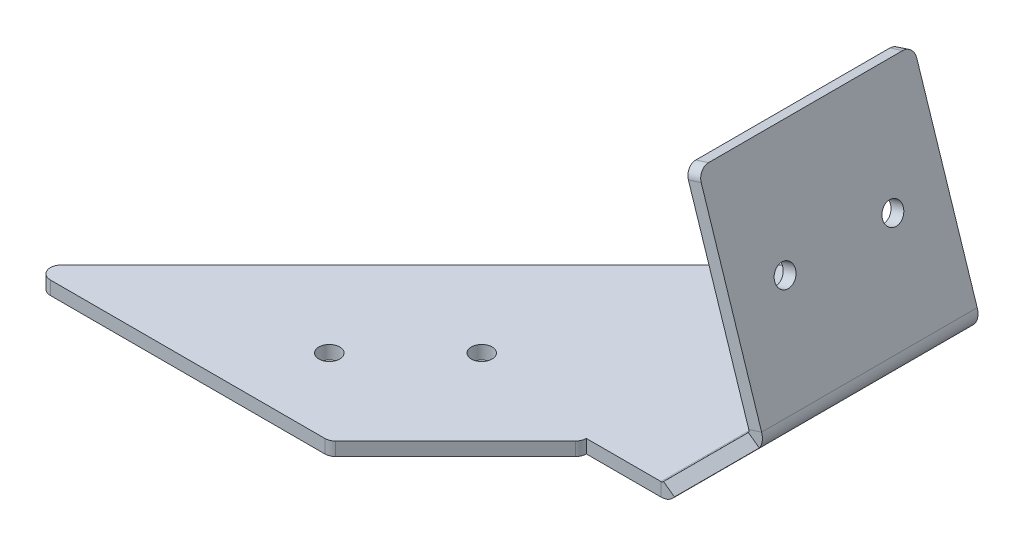
ISO-10303-21;
HEADER;
FILE_DESCRIPTION(('STEP AP214'),'2;1');
FILE_NAME('part.step','',(''),(''),'','','');
FILE_SCHEMA(('AUTOMOTIVE_DESIGN { 1 0 10303 214 1 1 1 1 }'));
ENDSEC;
DATA;
#1=APPLICATION_CONTEXT('core data for automotive mechanical design processes');
#2=APPLICATION_PROTOCOL_DEFINITION('international standard','automotive_design',2000,#1);
#3=PRODUCT_CONTEXT('',#1,'mechanical');
#4=PRODUCT('Part','Part','',(#3));
#5=PRODUCT_RELATED_PRODUCT_CATEGORY('part','',(#4));
#6=PRODUCT_DEFINITION_FORMATION('','',#4);
#7=PRODUCT_DEFINITION_CONTEXT('part definition',#1,'design');
#8=PRODUCT_DEFINITION('design','',#6,#7);
#9=PRODUCT_DEFINITION_SHAPE('','',#8);
#10=(LENGTH_UNIT() NAMED_UNIT(*) SI_UNIT(.MILLI.,.METRE.));
#11=(NAMED_UNIT(*) PLANE_ANGLE_UNIT() SI_UNIT($,.RADIAN.));
#12=(NAMED_UNIT(*) SI_UNIT($,.STERADIAN.) SOLID_ANGLE_UNIT());
#13=UNCERTAINTY_MEASURE_WITH_UNIT(LENGTH_MEASURE(1.E-05),#10,'distance_accuracy_value','');
#14=(GEOMETRIC_REPRESENTATION_CONTEXT(3) GLOBAL_UNCERTAINTY_ASSIGNED_CONTEXT((#13)) GLOBAL_UNIT_ASSIGNED_CONTEXT((#10,
#11,#12)) REPRESENTATION_CONTEXT('',''));
#15=CARTESIAN_POINT('',(0.,0.,0.));
#16=DIRECTION('',(0.,0.,1.));
#17=DIRECTION('',(1.,0.,0.));
#18=AXIS2_PLACEMENT_3D('',#15,#16,#17);
#19=CARTESIAN_POINT('',(-13.300085244457,-0.137855345025698,25.4));
#20=DIRECTION('',(0.,0.,1.));
#21=DIRECTION('',(-0.309016994374951,0.951056516295152,0.));
#22=AXIS2_PLACEMENT_3D('',#19,#20,#21);
#23=PLANE('',#22);
#24=DIRECTION('',(-0.309016994374951,0.951056516295152,0.));
#25=VECTOR('',#24,1.);
#26=CARTESIAN_POINT('',(-16.3196896836941,-1.11898430216617,25.4));
#27=LINE('',#26,#25);
#28=CARTESIAN_POINT('',(-16.9965644159594,0.964221918056588,25.4));
#29=VERTEX_POINT('',#28);
#30=CARTESIAN_POINT('',(-31.2328498322293,44.7790031742379,25.4));
#31=VERTEX_POINT('',#30);
#32=EDGE_CURVE('E197',#29,#31,#27,.T.);
#33=ORIENTED_EDGE('',*,*,#32,.F.);
#34=DIRECTION('',(0.951056516295152,0.309016994374951,0.));
#35=VECTOR('',#34,1.);
#36=CARTESIAN_POINT('',(-13.9769599767223,1.94535087519706,25.4));
#37=LINE('',#36,#35);
#38=CARTESIAN_POINT('',(-13.9769599767223,1.94535087519706,25.4));
#39=VERTEX_POINT('',#38);
#40=EDGE_CURVE('E180',#29,#39,#37,.T.);
#41=ORIENTED_EDGE('',*,*,#40,.T.);
#42=DIRECTION('',(-0.309016994374951,0.951056516295152,0.));
#43=VECTOR('',#42,1.);
#44=CARTESIAN_POINT('',(-13.300085244457,-0.137855345025698,25.4));
#45=LINE('',#44,#43);
#46=CARTESIAN_POINT('',(-28.2132453929921,45.7601321313783,25.4));
#47=VERTEX_POINT('',#46);
#48=EDGE_CURVE('E47',#39,#47,#45,.T.);
#49=ORIENTED_EDGE('',*,*,#48,.T.);
#50=DIRECTION('',(-0.951056516295152,-0.309016994374951,0.));
#51=VECTOR('',#50,1.);
#52=CARTESIAN_POINT('',(-28.2132453929921,45.7601321313783,25.4));
#53=LINE('',#52,#51);
#54=EDGE_CURVE('E226',#47,#31,#53,.T.);
#55=ORIENTED_EDGE('',*,*,#54,.T.);
#56=EDGE_LOOP('',(#33,#41,#49,#55));
#57=FACE_BOUND('',#56,.T.);
#58=ADVANCED_FACE('F43',(#57),#23,.T.);
#59=CARTESIAN_POINT('',(-7.18568958355758,-18.9560302103514,-25.4));
#60=DIRECTION('',(0.,0.,-1.));
#61=DIRECTION('',(0.309016994374951,-0.951056516295152,0.));
#62=AXIS2_PLACEMENT_3D('',#59,#60,#61);
#63=PLANE('',#62);
#64=DIRECTION('',(0.309016994374951,-0.951056516295152,0.));
#65=VECTOR('',#64,1.);
#66=CARTESIAN_POINT('',(-7.18568958355758,-18.9560302103514,-25.4));
#67=LINE('',#66,#65);
#68=CARTESIAN_POINT('',(-28.2132453929921,45.7601321313783,-25.4));
#69=VERTEX_POINT('',#68);
#70=CARTESIAN_POINT('',(-13.9769599767223,1.94535087519706,-25.4));
#71=VERTEX_POINT('',#70);
#72=EDGE_CURVE('E195',#69,#71,#67,.T.);
#73=ORIENTED_EDGE('',*,*,#72,.T.);
#74=DIRECTION('',(-0.951056516295152,-0.309016994374951,0.));
#75=VECTOR('',#74,1.);
#76=CARTESIAN_POINT('',(-13.9769599767223,1.94535087519706,-25.4));
#77=LINE('',#76,#75);
#78=CARTESIAN_POINT('',(-16.9965644159594,0.964221918056588,-25.4));
#79=VERTEX_POINT('',#78);
#80=EDGE_CURVE('E12',#71,#79,#77,.T.);
#81=ORIENTED_EDGE('',*,*,#80,.T.);
#82=DIRECTION('',(0.309016994374951,-0.951056516295152,0.));
#83=VECTOR('',#82,1.);
#84=CARTESIAN_POINT('',(-10.2052940227947,-19.9371591674918,-25.4));
#85=LINE('',#84,#83);
#86=CARTESIAN_POINT('',(-31.2328498322293,44.7790031742379,-25.4));
#87=VERTEX_POINT('',#86);
#88=EDGE_CURVE('E205',#87,#79,#85,.T.);
#89=ORIENTED_EDGE('',*,*,#88,.F.);
#90=DIRECTION('',(-0.951056516295152,-0.309016994374951,0.));
#91=VECTOR('',#90,1.);
#92=CARTESIAN_POINT('',(-28.2132453929921,45.7601321313783,-25.4));
#93=LINE('',#92,#91);
#94=EDGE_CURVE('E69',#69,#87,#93,.T.);
#95=ORIENTED_EDGE('',*,*,#94,.F.);
#96=EDGE_LOOP('',(#73,#81,#89,#95));
#97=FACE_BOUND('',#96,.T.);
#98=ADVANCED_FACE('F45',(#97),#63,.T.);
#99=CARTESIAN_POINT('',(-28.2132453929921,45.7601321313783,-22.86));
#100=DIRECTION('',(0.951056516295152,0.309016994374951,0.));
#101=DIRECTION('',(0.,0.,-1.));
#102=AXIS2_PLACEMENT_3D('',#99,#100,#101);
#103=PLANE('',#102);
#104=CARTESIAN_POINT('',(-21.1491169015808,24.0189801688712,12.7));
#105=DIRECTION('',(-0.951056516295152,-0.309016994374951,0.));
#106=DIRECTION('',(0.,0.,1.));
#107=AXIS2_PLACEMENT_3D('',#104,#105,#106);
#108=CIRCLE('',#107,2.4638);
#109=CARTESIAN_POINT('',(-21.1491169015808,24.0189801688712,15.1638));
#110=VERTEX_POINT('',#109);
#111=EDGE_CURVE('E207',#110,#110,#108,.T.);
#112=ORIENTED_EDGE('',*,*,#111,.T.);
#113=EDGE_LOOP('',(#112));
#114=FACE_BOUND('',#113,.T.);
#115=CARTESIAN_POINT('',(-21.1491169015808,24.0189801688712,-12.7));
#116=DIRECTION('',(-0.951056516295152,-0.309016994374951,0.));
#117=DIRECTION('',(0.,0.,1.));
#118=AXIS2_PLACEMENT_3D('',#115,#116,#117);
#119=CIRCLE('',#118,2.4638);
#120=CARTESIAN_POINT('',(-21.1491169015808,24.0189801688712,-10.2362));
#121=VERTEX_POINT('',#120);
#122=EDGE_CURVE('E236',#121,#121,#119,.T.);
#123=ORIENTED_EDGE('',*,*,#122,.T.);
#124=EDGE_LOOP('',(#123));
#125=FACE_BOUND('',#124,.T.);
#126=ORIENTED_EDGE('',*,*,#48,.F.);
#127=DIRECTION('',(0.,0.,-1.));
#128=VECTOR('',#127,1.);
#129=CARTESIAN_POINT('',(-13.9769599767223,1.94535087519706,-22.86));
#130=LINE('',#129,#128);
#131=EDGE_CURVE('E173',#39,#71,#130,.T.);
#132=ORIENTED_EDGE('',*,*,#131,.T.);
#133=ORIENTED_EDGE('',*,*,#72,.F.);
#134=CARTESIAN_POINT('',(-28.2132453929921,45.7601321313783,-22.86));
#135=DIRECTION('',(-0.951056516295152,-0.309016994374951,0.));
#136=DIRECTION('',(0.,0.,-1.));
#137=AXIS2_PLACEMENT_3D('',#134,#135,#136);
#138=CIRCLE('',#137,2.54000000000001);
#139=CARTESIAN_POINT('',(-28.9981485587045,48.175815682768,-22.86));
#140=VERTEX_POINT('',#139);
#141=EDGE_CURVE('E217',#140,#69,#138,.T.);
#142=ORIENTED_EDGE('',*,*,#141,.F.);
#143=DIRECTION('',(0.,0.,-1.));
#144=VECTOR('',#143,1.);
#145=CARTESIAN_POINT('',(-28.9981485587045,48.175815682768,22.86));
#146=LINE('',#145,#144);
#147=CARTESIAN_POINT('',(-28.9981485587045,48.175815682768,22.86));
#148=VERTEX_POINT('',#147);
#149=EDGE_CURVE('E227',#148,#140,#146,.T.);
#150=ORIENTED_EDGE('',*,*,#149,.F.);
#151=CARTESIAN_POINT('',(-28.2132453929921,45.7601321313783,22.86));
#152=DIRECTION('',(-0.951056516295152,-0.309016994374951,0.));
#153=DIRECTION('',(0.,0.,1.));
#154=AXIS2_PLACEMENT_3D('',#151,#152,#153);
#155=CIRCLE('',#154,2.54);
#156=EDGE_CURVE('E194',#47,#148,#155,.T.);
#157=ORIENTED_EDGE('',*,*,#156,.F.);
#158=EDGE_LOOP('',(#126,#132,#133,#142,#150,#157));
#159=FACE_BOUND('',#158,.T.);
#160=ADVANCED_FACE('F191',(#114,#125,#159),#103,.T.);
#161=CARTESIAN_POINT('',(-28.2132453929921,45.7601321313783,-22.86));
#162=DIRECTION('',(-0.951056516295152,-0.309016994374951,0.));
#163=DIRECTION('',(0.,0.,1.));
#164=AXIS2_PLACEMENT_3D('',#161,#162,#163);
#165=CYLINDRICAL_SURFACE('',#164,2.54000000000001);
#166=CARTESIAN_POINT('',(-31.2328498322293,44.7790031742379,-22.86));
#167=DIRECTION('',(-0.951056516295152,-0.309016994374951,0.));
#168=DIRECTION('',(0.,0.,-1.));
#169=AXIS2_PLACEMENT_3D('',#166,#167,#168);
#170=CIRCLE('',#169,2.54000000000001);
#171=CARTESIAN_POINT('',(-32.0177529979416,47.1946867256276,-22.86));
#172=VERTEX_POINT('',#171);
#173=EDGE_CURVE('E204',#172,#87,#170,.T.);
#174=ORIENTED_EDGE('',*,*,#173,.F.);
#175=DIRECTION('',(-0.951056516295152,-0.309016994374951,0.));
#176=VECTOR('',#175,1.);
#177=CARTESIAN_POINT('',(-28.9981485587045,48.175815682768,-22.86));
#178=LINE('',#177,#176);
#179=EDGE_CURVE('E223',#140,#172,#178,.T.);
#180=ORIENTED_EDGE('',*,*,#179,.F.);
#181=ORIENTED_EDGE('',*,*,#141,.T.);
#182=ORIENTED_EDGE('',*,*,#94,.T.);
#183=EDGE_LOOP('',(#174,#180,#181,#182));
#184=FACE_BOUND('',#183,.T.);
#185=ADVANCED_FACE('F442',(#184),#165,.T.);
#186=CARTESIAN_POINT('',(-28.9981485587045,48.175815682768,22.86));
#187=DIRECTION('',(-0.309016994374951,0.951056516295152,0.));
#188=DIRECTION('',(0.,0.,-1.));
#189=AXIS2_PLACEMENT_3D('',#186,#187,#188);
#190=PLANE('',#189);
#191=DIRECTION('',(0.,0.,-1.));
#192=VECTOR('',#191,1.);
#193=CARTESIAN_POINT('',(-32.0177529979416,47.1946867256276,22.86));
#194=LINE('',#193,#192);
#195=CARTESIAN_POINT('',(-32.0177529979416,47.1946867256276,22.86));
#196=VERTEX_POINT('',#195);
#197=EDGE_CURVE('E211',#196,#172,#194,.T.);
#198=ORIENTED_EDGE('',*,*,#197,.F.);
#199=DIRECTION('',(-0.951056516295152,-0.309016994374951,0.));
#200=VECTOR('',#199,1.);
#201=CARTESIAN_POINT('',(-28.9981485587045,48.175815682768,22.86));
#202=LINE('',#201,#200);
#203=EDGE_CURVE('E225',#148,#196,#202,.T.);
#204=ORIENTED_EDGE('',*,*,#203,.F.);
#205=ORIENTED_EDGE('',*,*,#149,.T.);
#206=ORIENTED_EDGE('',*,*,#179,.T.);
#207=EDGE_LOOP('',(#198,#204,#205,#206));
#208=FACE_BOUND('',#207,.T.);
#209=ADVANCED_FACE('F420',(#208),#190,.T.);
#210=CARTESIAN_POINT('',(-28.2132453929921,45.7601321313783,22.86));
#211=DIRECTION('',(-0.951056516295152,-0.309016994374951,0.));
#212=DIRECTION('',(0.,0.,1.));
#213=AXIS2_PLACEMENT_3D('',#210,#211,#212);
#214=CYLINDRICAL_SURFACE('',#213,2.54);
#215=CARTESIAN_POINT('',(-31.2328498322293,44.7790031742379,22.86));
#216=DIRECTION('',(-0.951056516295152,-0.309016994374951,0.));
#217=DIRECTION('',(0.,0.,1.));
#218=AXIS2_PLACEMENT_3D('',#215,#216,#217);
#219=CIRCLE('',#218,2.54);
#220=EDGE_CURVE('E208',#31,#196,#219,.T.);
#221=ORIENTED_EDGE('',*,*,#220,.F.);
#222=ORIENTED_EDGE('',*,*,#54,.F.);
#223=ORIENTED_EDGE('',*,*,#156,.T.);
#224=ORIENTED_EDGE('',*,*,#203,.T.);
#225=EDGE_LOOP('',(#221,#222,#223,#224));
#226=FACE_BOUND('',#225,.T.);
#227=ADVANCED_FACE('F412',(#226),#214,.T.);
#228=CARTESIAN_POINT('',(-31.2328498322293,44.7790031742379,-22.86));
#229=DIRECTION('',(0.951056516295152,0.309016994374951,0.));
#230=DIRECTION('',(0.,0.,-1.));
#231=AXIS2_PLACEMENT_3D('',#228,#229,#230);
#232=PLANE('',#231);
#233=DIRECTION('',(0.,0.,-1.));
#234=VECTOR('',#233,1.);
#235=CARTESIAN_POINT('',(-16.9965644159594,0.964221918056587,-22.86));
#236=LINE('',#235,#234);
#237=EDGE_CURVE('E52',#29,#79,#236,.T.);
#238=ORIENTED_EDGE('',*,*,#237,.F.);
#239=ORIENTED_EDGE('',*,*,#32,.T.);
#240=ORIENTED_EDGE('',*,*,#220,.T.);
#241=ORIENTED_EDGE('',*,*,#197,.T.);
#242=ORIENTED_EDGE('',*,*,#173,.T.);
#243=ORIENTED_EDGE('',*,*,#88,.T.);
#244=EDGE_LOOP('',(#238,#239,#240,#241,#242,#243));
#245=FACE_BOUND('',#244,.T.);
#246=CARTESIAN_POINT('',(-24.1687213408179,23.0378512117307,-12.7));
#247=DIRECTION('',(-0.951056516295152,-0.309016994374951,0.));
#248=DIRECTION('',(0.,0.,1.));
#249=AXIS2_PLACEMENT_3D('',#246,#247,#248);
#250=CIRCLE('',#249,2.4638);
#251=CARTESIAN_POINT('',(-24.1687213408179,23.0378512117307,-10.2362));
#252=VERTEX_POINT('',#251);
#253=EDGE_CURVE('E239',#252,#252,#250,.T.);
#254=ORIENTED_EDGE('',*,*,#253,.F.);
#255=EDGE_LOOP('',(#254));
#256=FACE_BOUND('',#255,.T.);
#257=CARTESIAN_POINT('',(-24.1687213408179,23.0378512117307,12.7));
#258=DIRECTION('',(-0.951056516295152,-0.309016994374951,0.));
#259=DIRECTION('',(0.,0.,1.));
#260=AXIS2_PLACEMENT_3D('',#257,#258,#259);
#261=CIRCLE('',#260,2.4638);
#262=CARTESIAN_POINT('',(-24.1687213408179,23.0378512117307,15.1638));
#263=VERTEX_POINT('',#262);
#264=EDGE_CURVE('E233',#263,#263,#261,.T.);
#265=ORIENTED_EDGE('',*,*,#264,.F.);
#266=EDGE_LOOP('',(#265));
#267=FACE_BOUND('',#266,.T.);
#268=ADVANCED_FACE('F409',(#245,#256,#267),#232,.F.);
#269=CARTESIAN_POINT('',(-21.1491169015808,24.0189801688712,12.7));
#270=DIRECTION('',(-0.951056516295152,-0.309016994374951,0.));
#271=DIRECTION('',(0.,0.,1.));
#272=AXIS2_PLACEMENT_3D('',#269,#270,#271);
#273=CYLINDRICAL_SURFACE('',#272,2.4638);
#274=ORIENTED_EDGE('',*,*,#111,.F.);
#275=EDGE_LOOP('',(#274));
#276=FACE_BOUND('',#275,.T.);
#277=ORIENTED_EDGE('',*,*,#264,.T.);
#278=EDGE_LOOP('',(#277));
#279=FACE_BOUND('',#278,.T.);
#280=ADVANCED_FACE('F411',(#276,#279),#273,.F.);
#281=CARTESIAN_POINT('',(-21.1491169015808,24.0189801688712,-12.7));
#282=DIRECTION('',(-0.951056516295152,-0.309016994374951,0.));
#283=DIRECTION('',(0.,0.,1.));
#284=AXIS2_PLACEMENT_3D('',#281,#282,#283);
#285=CYLINDRICAL_SURFACE('',#284,2.4638);
#286=ORIENTED_EDGE('',*,*,#122,.F.);
#287=EDGE_LOOP('',(#286));
#288=FACE_BOUND('',#287,.T.);
#289=ORIENTED_EDGE('',*,*,#253,.T.);
#290=EDGE_LOOP('',(#289));
#291=FACE_BOUND('',#290,.T.);
#292=ADVANCED_FACE('F417',(#288,#291),#285,.F.);
#293=CARTESIAN_POINT('',(-83.0117632735845,-3.175,58.2394877578619));
#294=DIRECTION('',(0.,1.,0.));
#295=DIRECTION('',(0.,0.,1.));
#296=AXIS2_PLACEMENT_3D('',#293,#294,#295);
#297=CYLINDRICAL_SURFACE('',#296,2.46380000000007);
#298=CARTESIAN_POINT('',(-83.0117632735845,-3.175,58.2394877578619));
#299=DIRECTION('',(0.,1.,0.));
#300=DIRECTION('',(0.,0.,1.));
#301=AXIS2_PLACEMENT_3D('',#298,#299,#300);
#302=CIRCLE('',#301,2.46380000000007);
#303=CARTESIAN_POINT('',(-83.0117632735845,-3.175,60.703287757862));
#304=VERTEX_POINT('',#303);
#305=EDGE_CURVE('E292',#304,#304,#302,.T.);
#306=ORIENTED_EDGE('',*,*,#305,.F.);
#307=EDGE_LOOP('',(#306));
#308=FACE_BOUND('',#307,.T.);
#309=CARTESIAN_POINT('',(-83.0117632735845,0.,58.2394877578619));
#310=DIRECTION('',(0.,1.,0.));
#311=DIRECTION('',(0.,0.,1.));
#312=AXIS2_PLACEMENT_3D('',#309,#310,#311);
#313=CIRCLE('',#312,2.46380000000007);
#314=CARTESIAN_POINT('',(-83.0117632735845,0.,60.703287757862));
#315=VERTEX_POINT('',#314);
#316=EDGE_CURVE('E253',#315,#315,#313,.T.);
#317=ORIENTED_EDGE('',*,*,#316,.T.);
#318=EDGE_LOOP('',(#317));
#319=FACE_BOUND('',#318,.T.);
#320=ADVANCED_FACE('F429',(#308,#319),#297,.F.);
#321=CARTESIAN_POINT('',(-65.0512510314461,-3.175,40.2789755157237));
#322=DIRECTION('',(0.,1.,0.));
#323=DIRECTION('',(0.,0.,1.));
#324=AXIS2_PLACEMENT_3D('',#321,#322,#323);
#325=CYLINDRICAL_SURFACE('',#324,2.46380000000007);
#326=CARTESIAN_POINT('',(-65.0512510314461,-3.175,40.2789755157237));
#327=DIRECTION('',(0.,1.,0.));
#328=DIRECTION('',(0.,0.,1.));
#329=AXIS2_PLACEMENT_3D('',#326,#327,#328);
#330=CIRCLE('',#329,2.46380000000007);
#331=CARTESIAN_POINT('',(-65.0512510314461,-3.175,42.7427755157238));
#332=VERTEX_POINT('',#331);
#333=EDGE_CURVE('E289',#332,#332,#330,.T.);
#334=ORIENTED_EDGE('',*,*,#333,.F.);
#335=EDGE_LOOP('',(#334));
#336=FACE_BOUND('',#335,.T.);
#337=CARTESIAN_POINT('',(-65.0512510314461,0.,40.2789755157237));
#338=DIRECTION('',(0.,1.,0.));
#339=DIRECTION('',(0.,0.,1.));
#340=AXIS2_PLACEMENT_3D('',#337,#338,#339);
#341=CIRCLE('',#340,2.46380000000007);
#342=CARTESIAN_POINT('',(-65.0512510314461,0.,42.7427755157238));
#343=VERTEX_POINT('',#342);
#344=EDGE_CURVE('E256',#343,#343,#341,.T.);
#345=ORIENTED_EDGE('',*,*,#344,.T.);
#346=EDGE_LOOP('',(#345));
#347=FACE_BOUND('',#346,.T.);
#348=ADVANCED_FACE('F435',(#336,#347),#325,.F.);
#349=CARTESIAN_POINT('',(-35.2933,-3.175,-25.4));
#350=DIRECTION('',(-0.707106781186551,0.,-0.707106781186544));
#351=DIRECTION('',(-0.707106781186544,0.,0.707106781186551));
#352=AXIS2_PLACEMENT_3D('',#349,#350,#351);
#353=PLANE('',#352);
#354=DIRECTION('',(-0.707106781186544,0.,0.707106781186551));
#355=VECTOR('',#354,1.);
#356=CARTESIAN_POINT('',(-35.2933,0.,-25.4));
#357=LINE('',#356,#355);
#358=CARTESIAN_POINT('',(-35.2933,0.,-25.4));
#359=VERTEX_POINT('',#358);
#360=CARTESIAN_POINT('',(-132.557248775785,0.,71.8639487757864));
#361=VERTEX_POINT('',#360);
#362=EDGE_CURVE('E304',#359,#361,#357,.T.);
#363=ORIENTED_EDGE('',*,*,#362,.F.);
#364=DIRECTION('',(0.,1.,0.));
#365=VECTOR('',#364,1.);
#366=CARTESIAN_POINT('',(-35.2933,-3.175,-25.4));
#367=LINE('',#366,#365);
#368=CARTESIAN_POINT('',(-35.2933,-3.175,-25.4));
#369=VERTEX_POINT('',#368);
#370=EDGE_CURVE('E242',#369,#359,#367,.T.);
#371=ORIENTED_EDGE('',*,*,#370,.F.);
#372=DIRECTION('',(-0.707106781186544,0.,0.707106781186551));
#373=VECTOR('',#372,1.);
#374=CARTESIAN_POINT('',(-35.2933,-3.175,-25.4));
#375=LINE('',#374,#373);
#376=CARTESIAN_POINT('',(-132.557248775785,-3.175,71.8639487757864));
#377=VERTEX_POINT('',#376);
#378=EDGE_CURVE('E259',#369,#377,#375,.T.);
#379=ORIENTED_EDGE('',*,*,#378,.T.);
#380=DIRECTION('',(0.,1.,0.));
#381=VECTOR('',#380,1.);
#382=CARTESIAN_POINT('',(-132.557248775785,-3.175,71.8639487757864));
#383=LINE('',#382,#381);
#384=EDGE_CURVE('E262',#377,#361,#383,.T.);
#385=ORIENTED_EDGE('',*,*,#384,.T.);
#386=EDGE_LOOP('',(#363,#371,#379,#385));
#387=FACE_BOUND('',#386,.T.);
#388=ADVANCED_FACE('F376',(#387),#353,.T.);
#389=CARTESIAN_POINT('',(-130.761197551571,-3.175,73.66));
#390=DIRECTION('',(0.,1.,0.));
#391=DIRECTION('',(0.,0.,1.));
#392=AXIS2_PLACEMENT_3D('',#389,#390,#391);
#393=CYLINDRICAL_SURFACE('',#392,2.54000000000008);
#394=CARTESIAN_POINT('',(-130.761197551571,0.,73.66));
#395=DIRECTION('',(0.,1.,0.));
#396=DIRECTION('',(0.,0.,1.));
#397=AXIS2_PLACEMENT_3D('',#394,#395,#396);
#398=CIRCLE('',#397,2.54000000000008);
#399=CARTESIAN_POINT('',(-130.761197551571,0.,76.2000000000001));
#400=VERTEX_POINT('',#399);
#401=EDGE_CURVE('E307',#361,#400,#398,.T.);
#402=ORIENTED_EDGE('',*,*,#401,.F.);
#403=ORIENTED_EDGE('',*,*,#384,.F.);
#404=CARTESIAN_POINT('',(-130.761197551571,-3.175,73.66));
#405=DIRECTION('',(0.,1.,0.));
#406=DIRECTION('',(0.,0.,1.));
#407=AXIS2_PLACEMENT_3D('',#404,#405,#406);
#408=CIRCLE('',#407,2.54000000000008);
#409=CARTESIAN_POINT('',(-130.761197551571,-3.175,76.2000000000001));
#410=VERTEX_POINT('',#409);
#411=EDGE_CURVE('E264',#377,#410,#408,.T.);
#412=ORIENTED_EDGE('',*,*,#411,.T.);
#413=DIRECTION('',(0.,1.,0.));
#414=VECTOR('',#413,1.);
#415=CARTESIAN_POINT('',(-130.761197551571,-3.175,76.2000000000001));
#416=LINE('',#415,#414);
#417=EDGE_CURVE('E267',#410,#400,#416,.T.);
#418=ORIENTED_EDGE('',*,*,#417,.T.);
#419=EDGE_LOOP('',(#402,#403,#412,#418));
#420=FACE_BOUND('',#419,.T.);
#421=ADVANCED_FACE('F380',(#420),#393,.T.);
#422=CARTESIAN_POINT('',(-130.761197551572,-3.175,76.2000000000003));
#423=DIRECTION('',(0.,0.,1.));
#424=DIRECTION('',(1.,0.,0.));
#425=AXIS2_PLACEMENT_3D('',#422,#423,#424);
#426=PLANE('',#425);
#427=DIRECTION('',(1.,0.,0.));
#428=VECTOR('',#427,1.);
#429=CARTESIAN_POINT('',(-130.761197551572,0.,76.2000000000003));
#430=LINE('',#429,#428);
#431=CARTESIAN_POINT('',(-66.1033534798737,0.,76.2));
#432=VERTEX_POINT('',#431);
#433=EDGE_CURVE('E310',#400,#432,#430,.T.);
#434=ORIENTED_EDGE('',*,*,#433,.F.);
#435=ORIENTED_EDGE('',*,*,#417,.F.);
#436=DIRECTION('',(1.,0.,0.));
#437=VECTOR('',#436,1.);
#438=CARTESIAN_POINT('',(-130.761197551572,-3.175,76.2000000000003));
#439=LINE('',#438,#437);
#440=CARTESIAN_POINT('',(-66.1033534798737,-3.175,76.2));
#441=VERTEX_POINT('',#440);
#442=EDGE_CURVE('E269',#410,#441,#439,.T.);
#443=ORIENTED_EDGE('',*,*,#442,.T.);
#444=DIRECTION('',(0.,1.,0.));
#445=VECTOR('',#444,1.);
#446=CARTESIAN_POINT('',(-66.1033534798737,-3.175,76.2));
#447=LINE('',#446,#445);
#448=EDGE_CURVE('E272',#441,#432,#447,.T.);
#449=ORIENTED_EDGE('',*,*,#448,.T.);
#450=EDGE_LOOP('',(#434,#435,#443,#449));
#451=FACE_BOUND('',#450,.T.);
#452=ADVANCED_FACE('F382',(#451),#426,.T.);
#453=CARTESIAN_POINT('',(-66.1033534798738,-3.175,73.66));
#454=DIRECTION('',(0.,1.,0.));
#455=DIRECTION('',(0.,0.,1.));
#456=AXIS2_PLACEMENT_3D('',#453,#454,#455);
#457=CYLINDRICAL_SURFACE('',#456,2.54000000000003);
#458=CARTESIAN_POINT('',(-66.1033534798738,0.,73.66));
#459=DIRECTION('',(0.,1.,0.));
#460=DIRECTION('',(0.,0.,1.));
#461=AXIS2_PLACEMENT_3D('',#458,#459,#460);
#462=CIRCLE('',#461,2.54000000000003);
#463=CARTESIAN_POINT('',(-64.3073022556599,0.,75.4560512242139));
#464=VERTEX_POINT('',#463);
#465=EDGE_CURVE('E313',#432,#464,#462,.T.);
#466=ORIENTED_EDGE('',*,*,#465,.F.);
#467=ORIENTED_EDGE('',*,*,#448,.F.);
#468=CARTESIAN_POINT('',(-66.1033534798738,-3.175,73.66));
#469=DIRECTION('',(0.,1.,0.));
#470=DIRECTION('',(0.,0.,1.));
#471=AXIS2_PLACEMENT_3D('',#468,#469,#470);
#472=CIRCLE('',#471,2.54000000000003);
#473=CARTESIAN_POINT('',(-64.3073022556599,-3.175,75.4560512242139));
#474=VERTEX_POINT('',#473);
#475=EDGE_CURVE('E274',#441,#474,#472,.T.);
#476=ORIENTED_EDGE('',*,*,#475,.T.);
#477=DIRECTION('',(0.,1.,0.));
#478=VECTOR('',#477,1.);
#479=CARTESIAN_POINT('',(-64.3073022556599,-3.175,75.4560512242139));
#480=LINE('',#479,#478);
#481=EDGE_CURVE('E277',#474,#464,#480,.T.);
#482=ORIENTED_EDGE('',*,*,#481,.T.);
#483=EDGE_LOOP('',(#466,#467,#476,#482));
#484=FACE_BOUND('',#483,.T.);
#485=ADVANCED_FACE('F386',(#484),#457,.T.);
#486=CARTESIAN_POINT('',(-36.0372487757862,-3.175,47.1859977443398));
#487=DIRECTION('',(0.707106781186552,0.,0.707106781186543));
#488=DIRECTION('',(0.707106781186543,0.,-0.707106781186552));
#489=AXIS2_PLACEMENT_3D('',#486,#487,#488);
#490=PLANE('',#489);
#491=DIRECTION('',(0.707106781186543,0.,-0.707106781186552));
#492=VECTOR('',#491,1.);
#493=CARTESIAN_POINT('',(-36.0372487757862,0.,47.1859977443398));
#494=LINE('',#493,#492);
#495=CARTESIAN_POINT('',(-36.0372487757862,0.,47.1859977443398));
#496=VERTEX_POINT('',#495);
#497=EDGE_CURVE('E316',#464,#496,#494,.T.);
#498=ORIENTED_EDGE('',*,*,#497,.F.);
#499=ORIENTED_EDGE('',*,*,#481,.F.);
#500=DIRECTION('',(0.707106781186543,0.,-0.707106781186552));
#501=VECTOR('',#500,1.);
#502=CARTESIAN_POINT('',(-36.0372487757862,-3.175,47.1859977443398));
#503=LINE('',#502,#501);
#504=CARTESIAN_POINT('',(-36.0372487757862,-3.175,47.1859977443398));
#505=VERTEX_POINT('',#504);
#506=EDGE_CURVE('E279',#474,#505,#503,.T.);
#507=ORIENTED_EDGE('',*,*,#506,.T.);
#508=DIRECTION('',(0.,1.,0.));
#509=VECTOR('',#508,1.);
#510=CARTESIAN_POINT('',(-36.0372487757862,-3.175,47.1859977443398));
#511=LINE('',#510,#509);
#512=EDGE_CURVE('E282',#505,#496,#511,.T.);
#513=ORIENTED_EDGE('',*,*,#512,.T.);
#514=EDGE_LOOP('',(#498,#499,#507,#513));
#515=FACE_BOUND('',#514,.T.);
#516=ADVANCED_FACE('F390',(#515),#490,.T.);
#517=CARTESIAN_POINT('',(-37.8333,-3.175,45.389946520126));
#518=DIRECTION('',(0.,1.,0.));
#519=DIRECTION('',(0.,0.,1.));
#520=AXIS2_PLACEMENT_3D('',#517,#518,#519);
#521=CYLINDRICAL_SURFACE('',#520,2.54);
#522=CARTESIAN_POINT('',(-37.8333,0.,45.389946520126));
#523=DIRECTION('',(0.,1.,0.));
#524=DIRECTION('',(0.,0.,-1.));
#525=AXIS2_PLACEMENT_3D('',#522,#523,#524);
#526=CIRCLE('',#525,2.54);
#527=CARTESIAN_POINT('',(-35.2933,0.,45.389946520126));
#528=VERTEX_POINT('',#527);
#529=EDGE_CURVE('E319',#496,#528,#526,.T.);
#530=ORIENTED_EDGE('',*,*,#529,.F.);
#531=ORIENTED_EDGE('',*,*,#512,.F.);
#532=CARTESIAN_POINT('',(-37.8333,-3.175,45.389946520126));
#533=DIRECTION('',(0.,1.,0.));
#534=DIRECTION('',(0.,0.,-1.));
#535=AXIS2_PLACEMENT_3D('',#532,#533,#534);
#536=CIRCLE('',#535,2.54);
#537=CARTESIAN_POINT('',(-35.2933,-3.175,45.389946520126));
#538=VERTEX_POINT('',#537);
#539=EDGE_CURVE('E284',#505,#538,#536,.T.);
#540=ORIENTED_EDGE('',*,*,#539,.T.);
#541=DIRECTION('',(0.,1.,0.));
#542=VECTOR('',#541,1.);
#543=CARTESIAN_POINT('',(-35.2933,-3.175,45.389946520126));
#544=LINE('',#543,#542);
#545=EDGE_CURVE('E287',#538,#528,#544,.T.);
#546=ORIENTED_EDGE('',*,*,#545,.T.);
#547=EDGE_LOOP('',(#530,#531,#540,#546));
#548=FACE_BOUND('',#547,.T.);
#549=ADVANCED_FACE('F393',(#548),#521,.T.);
#550=CARTESIAN_POINT('',(32.7533,-3.175,-22.86));
#551=DIRECTION('',(0.,-1.,0.));
#552=DIRECTION('',(0.,0.,-1.));
#553=AXIS2_PLACEMENT_3D('',#550,#551,#552);
#554=PLANE('',#553);
#555=DIRECTION('',(0.,0.,-1.));
#556=VECTOR('',#555,1.);
#557=CARTESIAN_POINT('',(-17.6971126458624,-3.175,-22.86));
#558=LINE('',#557,#556);
#559=CARTESIAN_POINT('',(-17.6971126458624,-3.175,45.3899465201259));
#560=VERTEX_POINT('',#559);
#561=CARTESIAN_POINT('',(-17.6971126458624,-3.175,-25.4));
#562=VERTEX_POINT('',#561);
#563=EDGE_CURVE('E245',#560,#562,#558,.T.);
#564=ORIENTED_EDGE('',*,*,#563,.F.);
#565=DIRECTION('',(1.,0.,0.));
#566=VECTOR('',#565,1.);
#567=CARTESIAN_POINT('',(-35.2933,-3.175,45.389946520126));
#568=LINE('',#567,#566);
#569=EDGE_CURVE('E295',#538,#560,#568,.T.);
#570=ORIENTED_EDGE('',*,*,#569,.F.);
#571=ORIENTED_EDGE('',*,*,#539,.F.);
#572=ORIENTED_EDGE('',*,*,#506,.F.);
#573=ORIENTED_EDGE('',*,*,#475,.F.);
#574=ORIENTED_EDGE('',*,*,#442,.F.);
#575=ORIENTED_EDGE('',*,*,#411,.F.);
#576=ORIENTED_EDGE('',*,*,#378,.F.);
#577=DIRECTION('',(-1.,0.,0.));
#578=VECTOR('',#577,1.);
#579=CARTESIAN_POINT('',(-35.2933,-3.175,-25.4));
#580=LINE('',#579,#578);
#581=EDGE_CURVE('E322',#562,#369,#580,.T.);
#582=ORIENTED_EDGE('',*,*,#581,.F.);
#583=EDGE_LOOP('',(#564,#570,#571,#572,#573,#574,#575,#576,#582));
#584=FACE_BOUND('',#583,.T.);
#585=ORIENTED_EDGE('',*,*,#333,.T.);
#586=EDGE_LOOP('',(#585));
#587=FACE_BOUND('',#586,.T.);
#588=ORIENTED_EDGE('',*,*,#305,.T.);
#589=EDGE_LOOP('',(#588));
#590=FACE_BOUND('',#589,.T.);
#591=ADVANCED_FACE('F368',(#584,#587,#590),#554,.T.);
#592=CARTESIAN_POINT('',(-35.2933,-3.175,45.389946520126));
#593=DIRECTION('',(0.,0.,1.));
#594=DIRECTION('',(1.,0.,0.));
#595=AXIS2_PLACEMENT_3D('',#592,#593,#594);
#596=PLANE('',#595);
#597=DIRECTION('',(0.,-1.,0.));
#598=VECTOR('',#597,1.);
#599=CARTESIAN_POINT('',(-17.6971126458624,-3.175,45.389946520126));
#600=LINE('',#599,#598);
#601=CARTESIAN_POINT('',(-17.6971126458624,0.,45.389946520126));
#602=VERTEX_POINT('',#601);
#603=EDGE_CURVE('E250',#602,#560,#600,.T.);
#604=ORIENTED_EDGE('',*,*,#603,.F.);
#605=DIRECTION('',(1.,0.,0.));
#606=VECTOR('',#605,1.);
#607=CARTESIAN_POINT('',(-35.2933,0.,45.389946520126));
#608=LINE('',#607,#606);
#609=EDGE_CURVE('E297',#528,#602,#608,.T.);
#610=ORIENTED_EDGE('',*,*,#609,.F.);
#611=ORIENTED_EDGE('',*,*,#545,.F.);
#612=ORIENTED_EDGE('',*,*,#569,.T.);
#613=EDGE_LOOP('',(#604,#610,#611,#612));
#614=FACE_BOUND('',#613,.T.);
#615=ADVANCED_FACE('F352',(#614),#596,.T.);
#616=CARTESIAN_POINT('',(32.7533,0.,-22.86));
#617=DIRECTION('',(0.,-1.,0.));
#618=DIRECTION('',(0.,0.,-1.));
#619=AXIS2_PLACEMENT_3D('',#616,#617,#618);
#620=PLANE('',#619);
#621=ORIENTED_EDGE('',*,*,#316,.F.);
#622=EDGE_LOOP('',(#621));
#623=FACE_BOUND('',#622,.T.);
#624=ORIENTED_EDGE('',*,*,#344,.F.);
#625=EDGE_LOOP('',(#624));
#626=FACE_BOUND('',#625,.T.);
#627=ORIENTED_EDGE('',*,*,#609,.T.);
#628=DIRECTION('',(0.,0.,-1.));
#629=VECTOR('',#628,1.);
#630=CARTESIAN_POINT('',(-17.6971126458624,0.,-22.86));
#631=LINE('',#630,#629);
#632=CARTESIAN_POINT('',(-17.6971126458624,0.,-25.4));
#633=VERTEX_POINT('',#632);
#634=EDGE_CURVE('E299',#602,#633,#631,.T.);
#635=ORIENTED_EDGE('',*,*,#634,.T.);
#636=DIRECTION('',(-1.,0.,0.));
#637=VECTOR('',#636,1.);
#638=CARTESIAN_POINT('',(-35.2933,0.,-25.4));
#639=LINE('',#638,#637);
#640=EDGE_CURVE('E302',#633,#359,#639,.T.);
#641=ORIENTED_EDGE('',*,*,#640,.T.);
#642=ORIENTED_EDGE('',*,*,#362,.T.);
#643=ORIENTED_EDGE('',*,*,#401,.T.);
#644=ORIENTED_EDGE('',*,*,#433,.T.);
#645=ORIENTED_EDGE('',*,*,#465,.T.);
#646=ORIENTED_EDGE('',*,*,#497,.T.);
#647=ORIENTED_EDGE('',*,*,#529,.T.);
#648=EDGE_LOOP('',(#627,#635,#641,#642,#643,#644,#645,#646,#647));
#649=FACE_BOUND('',#648,.T.);
#650=ADVANCED_FACE('F360',(#623,#626,#649),#620,.F.);
#651=CARTESIAN_POINT('',(-35.2933,-3.175,-25.4));
#652=DIRECTION('',(0.,0.,-1.));
#653=DIRECTION('',(-1.,0.,0.));
#654=AXIS2_PLACEMENT_3D('',#651,#652,#653);
#655=PLANE('',#654);
#656=DIRECTION('',(0.,1.,0.));
#657=VECTOR('',#656,1.);
#658=CARTESIAN_POINT('',(-17.6971126458624,-3.175,-25.4));
#659=LINE('',#658,#657);
#660=EDGE_CURVE('E247',#562,#633,#659,.T.);
#661=ORIENTED_EDGE('',*,*,#660,.F.);
#662=ORIENTED_EDGE('',*,*,#581,.T.);
#663=ORIENTED_EDGE('',*,*,#370,.T.);
#664=ORIENTED_EDGE('',*,*,#640,.F.);
#665=EDGE_LOOP('',(#661,#662,#663,#664));
#666=FACE_BOUND('',#665,.T.);
#667=ADVANCED_FACE('F365',(#666),#655,.T.);
#668=CARTESIAN_POINT('',(-17.6971126458624,0.7366,25.4));
#669=DIRECTION('',(0.,0.,1.));
#670=DIRECTION('',(1.,0.,0.));
#671=AXIS2_PLACEMENT_3D('',#668,#669,#670);
#672=PLANE('',#671);
#673=ORIENTED_EDGE('',*,*,#40,.F.);
#674=CARTESIAN_POINT('',(-17.6971126458624,0.7366,25.4));
#675=DIRECTION('',(0.,0.,1.));
#676=DIRECTION('',(1.,0.,0.));
#677=AXIS2_PLACEMENT_3D('',#674,#675,#676);
#678=CIRCLE('',#677,0.7366);
#679=CARTESIAN_POINT('',(-17.1011907278058,0.303637383161365,25.4));
#680=VERTEX_POINT('',#679);
#681=EDGE_CURVE('E332',#29,#680,#678,.F.);
#682=ORIENTED_EDGE('',*,*,#681,.T.);
#683=DIRECTION('',(0.809016994374949,-0.587785252292472,0.));
#684=VECTOR('',#683,1.);
#685=CARTESIAN_POINT('',(-14.5325617706654,-1.56258079286723,25.4));
#686=LINE('',#685,#684);
#687=CARTESIAN_POINT('',(-14.5325617706654,-1.56258079286723,25.4));
#688=VERTEX_POINT('',#687);
#689=EDGE_CURVE('E186',#680,#688,#686,.T.);
#690=ORIENTED_EDGE('',*,*,#689,.T.);
#691=CARTESIAN_POINT('',(-17.6971126458624,0.7366,25.4));
#692=DIRECTION('',(0.,0.,-1.));
#693=DIRECTION('',(1.,0.,0.));
#694=AXIS2_PLACEMENT_3D('',#691,#692,#693);
#695=CIRCLE('',#694,3.9116);
#696=EDGE_CURVE('E177',#39,#688,#695,.T.);
#697=ORIENTED_EDGE('',*,*,#696,.F.);
#698=EDGE_LOOP('',(#673,#682,#690,#697));
#699=FACE_BOUND('',#698,.T.);
#700=ADVANCED_FACE('F183',(#699),#672,.T.);
#701=CARTESIAN_POINT('',(-14.5325617706654,-1.56258079286723,35.394973260063));
#702=DIRECTION('',(0.587785252292472,0.809016994374948,0.));
#703=DIRECTION('',(0.,0.,1.));
#704=AXIS2_PLACEMENT_3D('',#701,#702,#703);
#705=PLANE('',#704);
#706=ORIENTED_EDGE('',*,*,#689,.F.);
#707=DIRECTION('',(0.,0.,1.));
#708=VECTOR('',#707,1.);
#709=CARTESIAN_POINT('',(-17.1011907278058,0.303637383161365,-61.0014265328766));
#710=LINE('',#709,#708);
#711=CARTESIAN_POINT('',(-17.1011907278058,0.303637383161365,45.3899465201259));
#712=VERTEX_POINT('',#711);
#713=EDGE_CURVE('E334',#680,#712,#710,.T.);
#714=ORIENTED_EDGE('',*,*,#713,.T.);
#715=DIRECTION('',(0.809016994374948,-0.587785252292472,0.));
#716=VECTOR('',#715,1.);
#717=CARTESIAN_POINT('',(-14.5325617706654,-1.56258079286723,45.3899465201259));
#718=LINE('',#717,#716);
#719=CARTESIAN_POINT('',(-14.5325617706654,-1.56258079286723,45.3899465201259));
#720=VERTEX_POINT('',#719);
#721=EDGE_CURVE('E327',#712,#720,#718,.T.);
#722=ORIENTED_EDGE('',*,*,#721,.T.);
#723=DIRECTION('',(0.,0.,1.));
#724=VECTOR('',#723,1.);
#725=CARTESIAN_POINT('',(-14.5325617706654,-1.56258079286723,45.3899465201259));
#726=LINE('',#725,#724);
#727=EDGE_CURVE('E187',#688,#720,#726,.T.);
#728=ORIENTED_EDGE('',*,*,#727,.F.);
#729=EDGE_LOOP('',(#706,#714,#722,#728));
#730=FACE_BOUND('',#729,.T.);
#731=ADVANCED_FACE('F583',(#730),#705,.T.);
#732=CARTESIAN_POINT('',(-17.6971126458624,0.7366,45.3899465201259));
#733=DIRECTION('',(0.,0.,1.));
#734=DIRECTION('',(1.,0.,0.));
#735=AXIS2_PLACEMENT_3D('',#732,#733,#734);
#736=PLANE('',#735);
#737=ORIENTED_EDGE('',*,*,#721,.F.);
#738=CARTESIAN_POINT('',(-17.6971126458624,0.7366,45.3899465201259));
#739=DIRECTION('',(0.,0.,1.));
#740=DIRECTION('',(1.,0.,0.));
#741=AXIS2_PLACEMENT_3D('',#738,#739,#740);
#742=CIRCLE('',#741,0.7366);
#743=EDGE_CURVE('E331',#712,#602,#742,.F.);
#744=ORIENTED_EDGE('',*,*,#743,.T.);
#745=ORIENTED_EDGE('',*,*,#603,.T.);
#746=CARTESIAN_POINT('',(-17.6971126458624,0.7366,45.3899465201259));
#747=DIRECTION('',(0.,0.,-1.));
#748=DIRECTION('',(1.,0.,0.));
#749=AXIS2_PLACEMENT_3D('',#746,#747,#748);
#750=CIRCLE('',#749,3.9116);
#751=EDGE_CURVE('E340',#720,#560,#750,.T.);
#752=ORIENTED_EDGE('',*,*,#751,.F.);
#753=EDGE_LOOP('',(#737,#744,#745,#752));
#754=FACE_BOUND('',#753,.T.);
#755=ADVANCED_FACE('F346',(#754),#736,.T.);
#756=CARTESIAN_POINT('',(-17.6971126458624,0.7366,-25.4));
#757=DIRECTION('',(0.,0.,-1.));
#758=DIRECTION('',(-1.,0.,0.));
#759=AXIS2_PLACEMENT_3D('',#756,#757,#758);
#760=PLANE('',#759);
#761=CARTESIAN_POINT('',(-17.6971126458624,0.7366,-25.4));
#762=DIRECTION('',(0.,0.,1.));
#763=DIRECTION('',(1.,0.,0.));
#764=AXIS2_PLACEMENT_3D('',#761,#762,#763);
#765=CIRCLE('',#764,0.7366);
#766=EDGE_CURVE('E188',#633,#79,#765,.T.);
#767=ORIENTED_EDGE('',*,*,#766,.T.);
#768=ORIENTED_EDGE('',*,*,#80,.F.);
#769=CARTESIAN_POINT('',(-17.6971126458624,0.7366,-25.4));
#770=DIRECTION('',(0.,0.,1.));
#771=DIRECTION('',(-1.,0.,0.));
#772=AXIS2_PLACEMENT_3D('',#769,#770,#771);
#773=CIRCLE('',#772,3.9116);
#774=EDGE_CURVE('E60',#562,#71,#773,.T.);
#775=ORIENTED_EDGE('',*,*,#774,.F.);
#776=ORIENTED_EDGE('',*,*,#660,.T.);
#777=EDGE_LOOP('',(#767,#768,#775,#776));
#778=FACE_BOUND('',#777,.T.);
#779=ADVANCED_FACE('F363',(#778),#760,.T.);
#780=CARTESIAN_POINT('',(-17.6971126458624,0.7366,-61.0014265328766));
#781=DIRECTION('',(0.,0.,1.));
#782=DIRECTION('',(1.,0.,0.));
#783=AXIS2_PLACEMENT_3D('',#780,#781,#782);
#784=CYLINDRICAL_SURFACE('',#783,3.9116);
#785=ORIENTED_EDGE('',*,*,#563,.T.);
#786=ORIENTED_EDGE('',*,*,#774,.T.);
#787=ORIENTED_EDGE('',*,*,#131,.F.);
#788=ORIENTED_EDGE('',*,*,#696,.T.);
#789=ORIENTED_EDGE('',*,*,#727,.T.);
#790=ORIENTED_EDGE('',*,*,#751,.T.);
#791=EDGE_LOOP('',(#785,#786,#787,#788,#789,#790));
#792=FACE_BOUND('',#791,.T.);
#793=ADVANCED_FACE('F175',(#792),#784,.T.);
#794=CARTESIAN_POINT('',(-17.6971126458624,0.7366,-61.0014265328766));
#795=DIRECTION('',(0.,0.,1.));
#796=DIRECTION('',(1.,0.,0.));
#797=AXIS2_PLACEMENT_3D('',#794,#795,#796);
#798=CYLINDRICAL_SURFACE('',#797,0.7366);
#799=ORIENTED_EDGE('',*,*,#634,.F.);
#800=ORIENTED_EDGE('',*,*,#743,.F.);
#801=ORIENTED_EDGE('',*,*,#713,.F.);
#802=ORIENTED_EDGE('',*,*,#681,.F.);
#803=ORIENTED_EDGE('',*,*,#237,.T.);
#804=ORIENTED_EDGE('',*,*,#766,.F.);
#805=EDGE_LOOP('',(#799,#800,#801,#802,#803,#804));
#806=FACE_BOUND('',#805,.T.);
#807=ADVANCED_FACE('F357',(#806),#798,.F.);
#808=CLOSED_SHELL('',(#58,#98,#160,#185,#209,#227,#268,#280,#292,#320,#348,#388,#421,#452,#485,
#516,#549,#591,#615,#650,#667,#700,#731,#755,#779,#793,#807));
#809=MANIFOLD_SOLID_BREP('B2',#808);
#810=ADVANCED_BREP_SHAPE_REPRESENTATION('',(#18,#809),#14);
#811=SHAPE_DEFINITION_REPRESENTATION(#9,#810);
ENDSEC;
END-ISO-10303-21;
